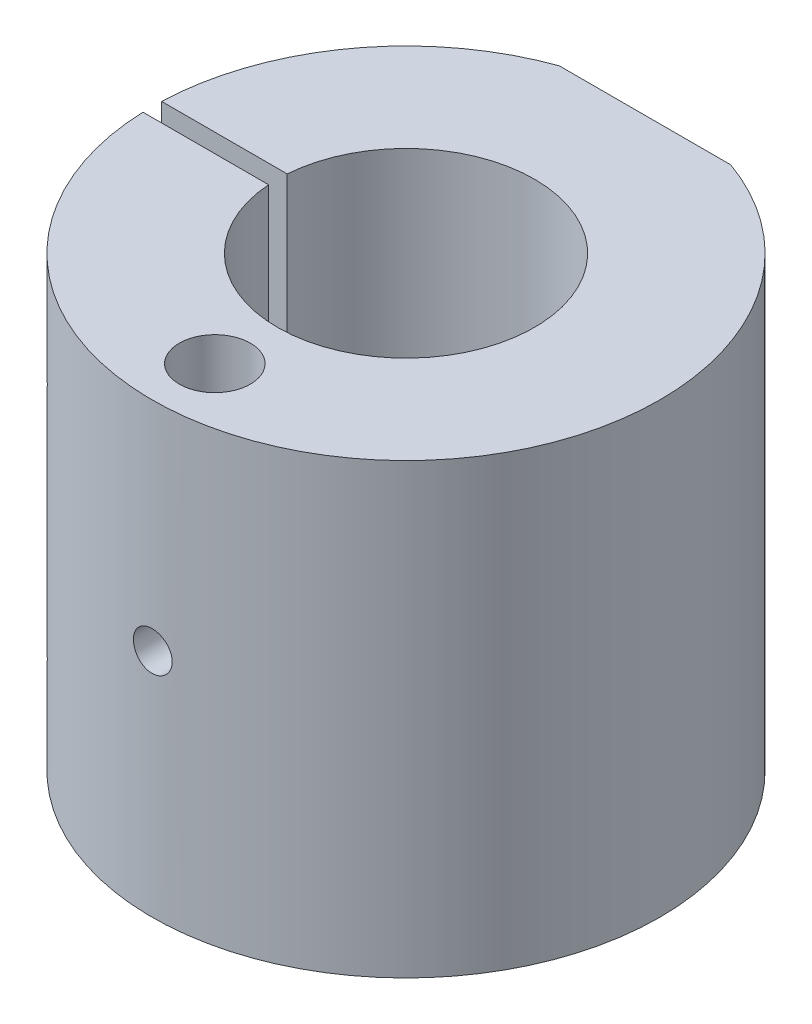
ISO-10303-21;
HEADER;
FILE_DESCRIPTION(('STEP AP214'),'2;1');
FILE_NAME('part.step','',(''),(''),'','','');
FILE_SCHEMA(('AUTOMOTIVE_DESIGN { 1 0 10303 214 1 1 1 1 }'));
ENDSEC;
DATA;
#1=APPLICATION_CONTEXT('core data for automotive mechanical design processes');
#2=APPLICATION_PROTOCOL_DEFINITION('international standard','automotive_design',2000,#1);
#3=PRODUCT_CONTEXT('',#1,'mechanical');
#4=PRODUCT('Part','Part','',(#3));
#5=PRODUCT_RELATED_PRODUCT_CATEGORY('part','',(#4));
#6=PRODUCT_DEFINITION_FORMATION('','',#4);
#7=PRODUCT_DEFINITION_CONTEXT('part definition',#1,'design');
#8=PRODUCT_DEFINITION('design','',#6,#7);
#9=PRODUCT_DEFINITION_SHAPE('','',#8);
#10=(LENGTH_UNIT() NAMED_UNIT(*) SI_UNIT(.MILLI.,.METRE.));
#11=(NAMED_UNIT(*) PLANE_ANGLE_UNIT() SI_UNIT($,.RADIAN.));
#12=(NAMED_UNIT(*) SI_UNIT($,.STERADIAN.) SOLID_ANGLE_UNIT());
#13=UNCERTAINTY_MEASURE_WITH_UNIT(LENGTH_MEASURE(1.E-05),#10,'distance_accuracy_value','');
#14=(GEOMETRIC_REPRESENTATION_CONTEXT(3) GLOBAL_UNCERTAINTY_ASSIGNED_CONTEXT((#13)) GLOBAL_UNIT_ASSIGNED_CONTEXT((#10,
#11,#12)) REPRESENTATION_CONTEXT('',''));
#15=CARTESIAN_POINT('',(0.,0.,0.));
#16=DIRECTION('',(0.,0.,1.));
#17=DIRECTION('',(1.,0.,0.));
#18=AXIS2_PLACEMENT_3D('',#15,#16,#17);
#19=CARTESIAN_POINT('',(0.,38.1,0.));
#20=DIRECTION('',(0.,-1.,0.));
#21=DIRECTION('',(0.,0.,-1.));
#22=AXIS2_PLACEMENT_3D('',#19,#20,#21);
#23=CYLINDRICAL_SURFACE('',#22,21.59);
#24=CARTESIAN_POINT('',(0.,38.1,0.));
#25=DIRECTION('',(0.,1.,0.));
#26=DIRECTION('',(0.,0.,1.));
#27=AXIS2_PLACEMENT_3D('',#24,#25,#26);
#28=CIRCLE('',#27,21.59);
#29=CARTESIAN_POINT('',(-7.29559456110329,38.1,-20.32));
#30=VERTEX_POINT('',#29);
#31=CARTESIAN_POINT('',(-21.5754040735626,38.1,-0.793749999999997));
#32=VERTEX_POINT('',#31);
#33=EDGE_CURVE('E41',#30,#32,#28,.T.);
#34=ORIENTED_EDGE('',*,*,#33,.F.);
#35=DIRECTION('',(0.,1.,0.));
#36=VECTOR('',#35,1.);
#37=CARTESIAN_POINT('',(-7.29559456110329,-0.001000000000001,-20.32));
#38=LINE('',#37,#36);
#39=CARTESIAN_POINT('',(-7.29559456110329,0.,-20.32));
#40=VERTEX_POINT('',#39);
#41=EDGE_CURVE('E100',#40,#30,#38,.T.);
#42=ORIENTED_EDGE('',*,*,#41,.F.);
#43=CARTESIAN_POINT('',(0.,0.,0.));
#44=DIRECTION('',(0.,1.,0.));
#45=DIRECTION('',(0.,0.,1.));
#46=AXIS2_PLACEMENT_3D('',#43,#44,#45);
#47=CIRCLE('',#46,21.59);
#48=CARTESIAN_POINT('',(-21.5754040735626,0.,-0.793749999999997));
#49=VERTEX_POINT('',#48);
#50=EDGE_CURVE('E139',#40,#49,#47,.T.);
#51=ORIENTED_EDGE('',*,*,#50,.T.);
#52=DIRECTION('',(0.,-1.,0.));
#53=VECTOR('',#52,1.);
#54=CARTESIAN_POINT('',(-21.5754040735626,38.1,-0.793749999999997));
#55=LINE('',#54,#53);
#56=EDGE_CURVE('E123',#32,#49,#55,.T.);
#57=ORIENTED_EDGE('',*,*,#56,.F.);
#58=EDGE_LOOP('',(#34,#42,#51,#57));
#59=FACE_BOUND('',#58,.T.);
#60=ADVANCED_FACE('F32',(#59),#23,.T.);
#61=CARTESIAN_POINT('',(0.,38.1,0.));
#62=DIRECTION('',(0.,1.,0.));
#63=DIRECTION('',(0.,0.,1.));
#64=AXIS2_PLACEMENT_3D('',#61,#62,#63);
#65=PLANE('',#64);
#66=DIRECTION('',(1.,0.,0.));
#67=VECTOR('',#66,1.);
#68=CARTESIAN_POINT('',(7.29559456110329,38.1,-20.32));
#69=LINE('',#68,#67);
#70=CARTESIAN_POINT('',(7.29559456110329,38.1,-20.32));
#71=VERTEX_POINT('',#70);
#72=EDGE_CURVE('E48',#30,#71,#69,.T.);
#73=ORIENTED_EDGE('',*,*,#72,.F.);
#74=ORIENTED_EDGE('',*,*,#33,.T.);
#75=DIRECTION('',(-1.,0.,0.));
#76=VECTOR('',#75,1.);
#77=CARTESIAN_POINT('',(0.,38.1,-0.79375));
#78=LINE('',#77,#76);
#79=CARTESIAN_POINT('',(-10.8931191555725,38.1,-0.793749999999999));
#80=VERTEX_POINT('',#79);
#81=EDGE_CURVE('E129',#80,#32,#78,.T.);
#82=ORIENTED_EDGE('',*,*,#81,.F.);
#83=CARTESIAN_POINT('',(0.,38.1,0.));
#84=DIRECTION('',(0.,1.,0.));
#85=DIRECTION('',(0.,0.,1.));
#86=AXIS2_PLACEMENT_3D('',#83,#84,#85);
#87=CIRCLE('',#86,10.922);
#88=CARTESIAN_POINT('',(-10.8931191555725,38.1,0.793750000000001));
#89=VERTEX_POINT('',#88);
#90=EDGE_CURVE('E136',#89,#80,#87,.T.);
#91=ORIENTED_EDGE('',*,*,#90,.F.);
#92=DIRECTION('',(1.,0.,0.));
#93=VECTOR('',#92,1.);
#94=CARTESIAN_POINT('',(0.,38.1,0.79375));
#95=LINE('',#94,#93);
#96=CARTESIAN_POINT('',(-21.5754040735626,38.1,0.793750000000003));
#97=VERTEX_POINT('',#96);
#98=EDGE_CURVE('E132',#97,#89,#95,.T.);
#99=ORIENTED_EDGE('',*,*,#98,.F.);
#100=EDGE_CURVE('E11',#97,#71,#28,.T.);
#101=ORIENTED_EDGE('',*,*,#100,.T.);
#102=EDGE_LOOP('',(#73,#74,#82,#91,#99,#101));
#103=FACE_BOUND('',#102,.T.);
#104=CARTESIAN_POINT('',(0.,38.1,16.256));
#105=DIRECTION('',(0.,1.,0.));
#106=DIRECTION('',(0.,0.,1.));
#107=AXIS2_PLACEMENT_3D('',#104,#105,#106);
#108=CIRCLE('',#107,3.0226);
#109=CARTESIAN_POINT('',(0.,38.1,19.2786));
#110=VERTEX_POINT('',#109);
#111=EDGE_CURVE('E112',#110,#110,#108,.T.);
#112=ORIENTED_EDGE('',*,*,#111,.F.);
#113=EDGE_LOOP('',(#112));
#114=FACE_BOUND('',#113,.T.);
#115=ADVANCED_FACE('F154',(#103,#114),#65,.T.);
#116=CARTESIAN_POINT('',(0.,0.,0.));
#117=DIRECTION('',(0.,1.,0.));
#118=DIRECTION('',(0.,0.,1.));
#119=AXIS2_PLACEMENT_3D('',#116,#117,#118);
#120=PLANE('',#119);
#121=CARTESIAN_POINT('',(0.,0.,16.256));
#122=DIRECTION('',(0.,1.,0.));
#123=DIRECTION('',(0.,0.,1.));
#124=AXIS2_PLACEMENT_3D('',#121,#122,#123);
#125=CIRCLE('',#124,3.0226);
#126=CARTESIAN_POINT('',(0.,0.,19.2786));
#127=VERTEX_POINT('',#126);
#128=EDGE_CURVE('E115',#127,#127,#125,.F.);
#129=ORIENTED_EDGE('',*,*,#128,.F.);
#130=EDGE_LOOP('',(#129));
#131=FACE_BOUND('',#130,.T.);
#132=ORIENTED_EDGE('',*,*,#50,.F.);
#133=DIRECTION('',(-1.,0.,0.));
#134=VECTOR('',#133,1.);
#135=CARTESIAN_POINT('',(7.29559456110329,0.,-20.32));
#136=LINE('',#135,#134);
#137=CARTESIAN_POINT('',(7.29559456110329,0.,-20.32));
#138=VERTEX_POINT('',#137);
#139=EDGE_CURVE('E109',#138,#40,#136,.T.);
#140=ORIENTED_EDGE('',*,*,#139,.F.);
#141=CARTESIAN_POINT('',(-21.5754040735626,0.,0.793750000000003));
#142=VERTEX_POINT('',#141);
#143=EDGE_CURVE('E36',#142,#138,#47,.T.);
#144=ORIENTED_EDGE('',*,*,#143,.F.);
#145=DIRECTION('',(-1.,0.,0.));
#146=VECTOR('',#145,1.);
#147=CARTESIAN_POINT('',(0.,0.,0.79375));
#148=LINE('',#147,#146);
#149=CARTESIAN_POINT('',(-10.8931191555725,0.,0.793750000000001));
#150=VERTEX_POINT('',#149);
#151=EDGE_CURVE('E127',#150,#142,#148,.T.);
#152=ORIENTED_EDGE('',*,*,#151,.F.);
#153=CARTESIAN_POINT('',(0.,0.,0.));
#154=DIRECTION('',(0.,1.,0.));
#155=DIRECTION('',(0.,0.,1.));
#156=AXIS2_PLACEMENT_3D('',#153,#154,#155);
#157=CIRCLE('',#156,10.922);
#158=CARTESIAN_POINT('',(-10.8931191555725,0.,-0.793749999999999));
#159=VERTEX_POINT('',#158);
#160=EDGE_CURVE('E135',#150,#159,#157,.T.);
#161=ORIENTED_EDGE('',*,*,#160,.T.);
#162=DIRECTION('',(1.,0.,0.));
#163=VECTOR('',#162,1.);
#164=CARTESIAN_POINT('',(0.,0.,-0.79375));
#165=LINE('',#164,#163);
#166=EDGE_CURVE('E56',#49,#159,#165,.T.);
#167=ORIENTED_EDGE('',*,*,#166,.F.);
#168=EDGE_LOOP('',(#132,#140,#144,#152,#161,#167));
#169=FACE_BOUND('',#168,.T.);
#170=ADVANCED_FACE('F145',(#131,#169),#120,.F.);
#171=CARTESIAN_POINT('',(-17.8842616145675,29.1092355947267,12.0946800909204));
#172=CARTESIAN_POINT('',(-17.8842585584311,29.1645112923969,12.0946849197344));
#173=CARTESIAN_POINT('',(-17.8814572272963,29.2198141170862,12.0988300645471));
#174=CARTESIAN_POINT('',(-17.8705178537524,29.3287236810063,12.114981650848));
#175=CARTESIAN_POINT('',(-17.8623733870349,29.3823282969634,12.1269975557019));
#176=CARTESIAN_POINT('',(-17.8390428583441,29.4983717990455,12.1612978423738));
#177=CARTESIAN_POINT('',(-17.8226798560821,29.5600623082845,12.1852913730921));
#178=CARTESIAN_POINT('',(-17.7844092639658,29.6779206339718,12.2410797122205));
#179=CARTESIAN_POINT('',(-17.7624916573325,29.7340782159082,12.272888611114));
#180=CARTESIAN_POINT('',(-17.7021786253477,29.8678650941383,12.3598131360766));
#181=CARTESIAN_POINT('',(-17.6610722740068,29.941887306217,12.4185541520384));
#182=CARTESIAN_POINT('',(-17.5722168533333,30.0782690994564,12.5439725121161));
#183=CARTESIAN_POINT('',(-17.5244513932063,30.140598984916,12.6106693784964));
#184=CARTESIAN_POINT('',(-17.4330611129427,30.2446953739167,12.7366173584903));
#185=CARTESIAN_POINT('',(-17.390220675252,30.2881462643902,12.7950704346375));
#186=CARTESIAN_POINT('',(-17.3018580064292,30.3687262773738,12.9143067796996));
#187=CARTESIAN_POINT('',(-17.2563341085997,30.4058514140689,12.9750914884301));
#188=CARTESIAN_POINT('',(-17.1630301734843,30.4742394300064,13.0982620054874));
#189=CARTESIAN_POINT('',(-17.1152487084977,30.5054985356958,13.1606488152965));
#190=CARTESIAN_POINT('',(-17.0177614025057,30.5624433797972,13.2864686226405));
#191=CARTESIAN_POINT('',(-16.9680547882346,30.5881268507293,13.3499020345623));
#192=CARTESIAN_POINT('',(-16.8107302256385,30.6597102193637,13.548316600322));
#193=CARTESIAN_POINT('',(-16.7001759514523,30.696334382109,13.6844250475389));
#194=CARTESIAN_POINT('',(-16.4736455196231,30.7458853081251,13.9563052067048));
#195=CARTESIAN_POINT('',(-16.3576704918395,30.7588169872829,14.0920769826691));
#196=CARTESIAN_POINT('',(-16.1227397021436,30.7596328204156,14.3602577938445));
#197=CARTESIAN_POINT('',(-16.0037976672796,30.7476166288553,14.4926780776448));
#198=CARTESIAN_POINT('',(-15.7653949829693,30.6959029004973,14.7516512659179));
#199=CARTESIAN_POINT('',(-15.6459351458561,30.656239241519,14.8782111492432));
#200=CARTESIAN_POINT('',(-15.44712543031,30.5621778983121,15.084040837782));
#201=CARTESIAN_POINT('',(-15.3666530646227,30.5159617818699,15.1659624368816));
#202=CARTESIAN_POINT('',(-15.2103500011545,30.4066084309901,15.3227122435066));
#203=CARTESIAN_POINT('',(-15.1345126755737,30.343496086993,15.3975506677569));
#204=CARTESIAN_POINT('',(-15.0081440129358,30.2161118135675,15.5206183746334));
#205=CARTESIAN_POINT('',(-14.9558643058362,30.1556286737283,15.5709592075219));
#206=CARTESIAN_POINT('',(-14.8585029439286,30.0238259659124,15.6638916091562));
#207=CARTESIAN_POINT('',(-14.8134122016301,29.9525203048657,15.7064929709427));
#208=CARTESIAN_POINT('',(-14.7406620301069,29.8139313265651,15.7747584769749));
#209=CARTESIAN_POINT('',(-14.7113204368668,29.7483633283255,15.8020989405364));
#210=CARTESIAN_POINT('',(-14.6608659703766,29.6114659544436,15.8489210375911));
#211=CARTESIAN_POINT('',(-14.6397487678209,29.5401396339109,15.8684068059724));
#212=CARTESIAN_POINT('',(-14.6070932631717,29.3930135812178,15.8984726656273));
#213=CARTESIAN_POINT('',(-14.5956123924403,29.3171898720288,15.9089993670831));
#214=CARTESIAN_POINT('',(-14.5833823428621,29.1639641962526,15.9202115284396));
#215=CARTESIAN_POINT('',(-14.5826288389539,29.0865628783317,15.9209009545349));
#216=CARTESIAN_POINT('',(-14.5914323644677,28.9406586228388,15.9128320278873));
#217=CARTESIAN_POINT('',(-14.599969761122,28.8720373546274,15.905007998292));
#218=CARTESIAN_POINT('',(-14.6251935422651,28.7376511212979,15.8818167866163));
#219=CARTESIAN_POINT('',(-14.6418801298901,28.6718862274257,15.8664494165019));
#220=CARTESIAN_POINT('',(-14.6829037339814,28.5431381235274,15.8284942082047));
#221=CARTESIAN_POINT('',(-14.7074156746269,28.4802603582335,15.8057410545568));
#222=CARTESIAN_POINT('',(-14.762676512127,28.3600195190934,15.7541395933262));
#223=CARTESIAN_POINT('',(-14.7934286040355,28.3026592925792,15.7252881630152));
#224=CARTESIAN_POINT('',(-14.8748081860302,28.1696146279086,15.6484033976926));
#225=CARTESIAN_POINT('',(-14.9281716891288,28.097216542698,15.5975637779813));
#226=CARTESIAN_POINT('',(-15.0420090865757,27.9652664469093,15.4878132414272));
#227=CARTESIAN_POINT('',(-15.1024977071319,27.9057417891195,15.4288855651509));
#228=CARTESIAN_POINT('',(-15.2516104423623,27.7789162389359,15.2817243823099));
#229=CARTESIAN_POINT('',(-15.3422565097745,27.7171182456415,15.1908074738995));
#230=CARTESIAN_POINT('',(-15.5273981404125,27.6145520590779,15.0015230460747));
#231=CARTESIAN_POINT('',(-15.6218992187096,27.5738152222445,14.903144666074));
#232=CARTESIAN_POINT('',(-15.8473927615106,27.4993517899627,14.6637054599595));
#233=CARTESIAN_POINT('',(-15.9788214439848,27.473937595291,14.5204359628176));
#234=CARTESIAN_POINT('',(-16.173602389331,27.4590640519481,14.3021803774759));
#235=CARTESIAN_POINT('',(-16.2382193297395,27.4579948276925,14.2287709400857));
#236=CARTESIAN_POINT('',(-16.3663180723804,27.463280561377,14.0812368456421));
#237=CARTESIAN_POINT('',(-16.4298003088919,27.4696326144428,14.0071124796897));
#238=CARTESIAN_POINT('',(-16.5566742161214,27.4897392317191,13.8569307243798));
#239=CARTESIAN_POINT('',(-16.6200323855149,27.5036555000825,13.7808670488909));
#240=CARTESIAN_POINT('',(-16.7448493511203,27.5388841052749,13.6289316863076));
#241=CARTESIAN_POINT('',(-16.8063087582584,27.5601940356278,13.5530599448266));
#242=CARTESIAN_POINT('',(-16.9269306239158,27.6102461409653,13.4021058087891));
#243=CARTESIAN_POINT('',(-16.9860959690377,27.6389786024766,13.3270225150763));
#244=CARTESIAN_POINT('',(-17.1017915387924,27.7041388111514,13.178228384632));
#245=CARTESIAN_POINT('',(-17.1583230595029,27.7405627235517,13.1045168838132));
#246=CARTESIAN_POINT('',(-17.2792735064005,27.8297127355676,12.9447569599658));
#247=CARTESIAN_POINT('',(-17.3430128361252,27.884241820427,12.8591847416955));
#248=CARTESIAN_POINT('',(-17.4646877403234,28.0065160425828,12.6934350982814));
#249=CARTESIAN_POINT('',(-17.5226292148152,28.0742475335283,12.6132522166944));
#250=CARTESIAN_POINT('',(-17.6154360323137,28.2040661962542,12.483150122214));
#251=CARTESIAN_POINT('',(-17.6522441974051,28.2625076184724,12.431005675959));
#252=CARTESIAN_POINT('',(-17.7201138987545,28.388244490511,12.3340641361412));
#253=CARTESIAN_POINT('',(-17.7511853404747,28.4555243287413,12.2892543933953));
#254=CARTESIAN_POINT('',(-17.7974218277339,28.5782160002861,12.2221533550142));
#255=CARTESIAN_POINT('',(-17.8145820634211,28.6313542701135,12.1971076601833));
#256=CARTESIAN_POINT('',(-17.8438317185316,28.7417777321301,12.1542768301767));
#257=CARTESIAN_POINT('',(-17.855931801176,28.7990539025784,12.1364764291857));
#258=CARTESIAN_POINT('',(-17.8713010471485,28.8987125838817,12.113827840313));
#259=CARTESIAN_POINT('',(-17.8761358244356,28.9403395398661,12.1066882968306));
#260=CARTESIAN_POINT('',(-17.8826172206868,29.0243842200103,12.097112657936));
#261=CARTESIAN_POINT('',(-17.884263960682,29.0668019140886,12.0946763839686));
#262=CARTESIAN_POINT('',(-17.8842616145675,29.1092355947267,12.0946800909204));
#263=B_SPLINE_CURVE_WITH_KNOTS('',3,(#171,#172,#173,#174,#175,#176,#177,#178,#179,#180,#181,
#182,#183,#184,#185,#186,#187,#188,#189,#190,#191,#192,#193,#194,#195,#196,#197,#198,#199,#200,
#201,#202,#203,#204,#205,#206,#207,#208,#209,#210,#211,#212,#213,#214,#215,#216,#217,#218,#219,
#220,#221,#222,#223,#224,#225,#226,#227,#228,#229,#230,#231,#232,#233,#234,#235,#236,#237,#238,
#239,#240,#241,#242,#243,#244,#245,#246,#247,#248,#249,#250,#251,#252,#253,#254,#255,#256,#257,
#258,#259,#260,#261,#262),.UNSPECIFIED.,.T.,.F.,(4,2,2,2,2,2,2,2,2,2,2,2,2,2,2,2,2,2,2,2,2,2,2,
2,2,2,2,2,2,2,2,2,2,2,2,2,2,2,2,2,2,2,2,2,2,4),(0.,0.165659078587435,0.331517702981557,
0.534935807254163,0.738723384473475,1.04616357672133,1.35437432358516,1.60753195243394,
1.86084850902818,2.11432746690892,2.36790931642835,2.90345810024024,3.43889575194419,
3.97219870933683,4.50484933018719,4.87506917664172,5.24474661167796,5.5271799054836,
5.80925329828255,6.03890387535631,6.26843340083052,6.49932137187992,6.73011625084476,
6.93791990459857,7.14572873857067,7.35855306871122,7.57148664440744,7.87970602018601,
8.18857398689369,8.6136715059996,9.03940011264916,9.62426561065011,9.9174726319828,
10.2105649231623,10.510184402259,10.8097064530741,11.108838503529,11.4078217649414,
11.7665166478851,12.1248427218824,12.3837748211045,12.6422555595924,12.8252366201451,
13.0078301190627,13.1350070090302,13.2621790707475),.UNSPECIFIED.);
#264=CARTESIAN_POINT('',(-17.8842616145675,29.1092355947267,12.0946800909204));
#265=VERTEX_POINT('',#264);
#266=EDGE_CURVE('E196',#265,#265,#263,.T.);
#267=ORIENTED_EDGE('',*,*,#266,.T.);
#268=EDGE_LOOP('',(#267));
#269=FACE_BOUND('',#268,.T.);
#270=CARTESIAN_POINT('',(-17.8842616145675,8.90395449077097,12.0946800909204));
#271=CARTESIAN_POINT('',(-17.8842585584311,8.95923018844116,12.0946849197344));
#272=CARTESIAN_POINT('',(-17.8814572272963,9.01453301313049,12.0988300645471));
#273=CARTESIAN_POINT('',(-17.8705178537524,9.12344257705059,12.114981650848));
#274=CARTESIAN_POINT('',(-17.8623733870349,9.17704719300767,12.1269975557019));
#275=CARTESIAN_POINT('',(-17.8390428583441,9.29309069508979,12.1612978423738));
#276=CARTESIAN_POINT('',(-17.8226798560821,9.35478120432878,12.1852913730921));
#277=CARTESIAN_POINT('',(-17.7844092639658,9.472639530016,12.2410797122205));
#278=CARTESIAN_POINT('',(-17.7624916573325,9.52879711195247,12.272888611114));
#279=CARTESIAN_POINT('',(-17.7021786253477,9.66258399018259,12.3598131360766));
#280=CARTESIAN_POINT('',(-17.6610722740068,9.73660620226129,12.4185541520384));
#281=CARTESIAN_POINT('',(-17.5722168533332,9.87298799550064,12.5439725121161));
#282=CARTESIAN_POINT('',(-17.5244513932063,9.93531788096027,12.6106693784964));
#283=CARTESIAN_POINT('',(-17.4330611129427,10.039414269961,12.7366173584903));
#284=CARTESIAN_POINT('',(-17.390220675252,10.0828651604344,12.7950704346375));
#285=CARTESIAN_POINT('',(-17.3018580064292,10.1634451734181,12.9143067796996));
#286=CARTESIAN_POINT('',(-17.2563341085997,10.2005703101132,12.9750914884301));
#287=CARTESIAN_POINT('',(-17.1630301734843,10.2689583260507,13.0982620054874));
#288=CARTESIAN_POINT('',(-17.1152487084977,10.3002174317401,13.1606488152965));
#289=CARTESIAN_POINT('',(-17.0177614025057,10.3571622758414,13.2864686226405));
#290=CARTESIAN_POINT('',(-16.9680547882346,10.3828457467735,13.3499020345623));
#291=CARTESIAN_POINT('',(-16.8107302256385,10.4544291154079,13.548316600322));
#292=CARTESIAN_POINT('',(-16.7001759514523,10.4910532781533,13.6844250475389));
#293=CARTESIAN_POINT('',(-16.4736455196231,10.5406042041693,13.9563052067048));
#294=CARTESIAN_POINT('',(-16.3576704918395,10.5535358833271,14.0920769826691));
#295=CARTESIAN_POINT('',(-16.1227397021436,10.5543517164599,14.3602577938445));
#296=CARTESIAN_POINT('',(-16.0037976672796,10.5423355248995,14.4926780776448));
#297=CARTESIAN_POINT('',(-15.7653949829692,10.4906217965416,14.7516512659179));
#298=CARTESIAN_POINT('',(-15.6459351458561,10.4509581375632,14.8782111492432));
#299=CARTESIAN_POINT('',(-15.44712543031,10.3568967943563,15.084040837782));
#300=CARTESIAN_POINT('',(-15.3666530646227,10.3106806779142,15.1659624368816));
#301=CARTESIAN_POINT('',(-15.2103500011545,10.2013273270343,15.3227122435066));
#302=CARTESIAN_POINT('',(-15.1345126755737,10.1382149830372,15.3975506677569));
#303=CARTESIAN_POINT('',(-15.0081440129358,10.0108307096118,15.5206183746334));
#304=CARTESIAN_POINT('',(-14.9558643058362,9.95034756977252,15.5709592075219));
#305=CARTESIAN_POINT('',(-14.8585029439286,9.81854486195667,15.6638916091562));
#306=CARTESIAN_POINT('',(-14.8134122016301,9.74723920090991,15.7064929709427));
#307=CARTESIAN_POINT('',(-14.7406620301069,9.60865022260932,15.7747584769749));
#308=CARTESIAN_POINT('',(-14.7113204368668,9.54308222436972,15.8020989405364));
#309=CARTESIAN_POINT('',(-14.6608659703766,9.40618485048783,15.8489210375911));
#310=CARTESIAN_POINT('',(-14.6397487678209,9.33485852995519,15.8684068059724));
#311=CARTESIAN_POINT('',(-14.6070932631717,9.18773247726206,15.8984726656274));
#312=CARTESIAN_POINT('',(-14.5956123924403,9.11190876807305,15.9089993670831));
#313=CARTESIAN_POINT('',(-14.5833823428621,8.95868309229688,15.9202115284396));
#314=CARTESIAN_POINT('',(-14.5826288389539,8.88128177437597,15.9209009545349));
#315=CARTESIAN_POINT('',(-14.5914323644677,8.73537751888308,15.9128320278873));
#316=CARTESIAN_POINT('',(-14.599969761122,8.66675625067163,15.905007998292));
#317=CARTESIAN_POINT('',(-14.6251935422651,8.53237001734219,15.8818167866163));
#318=CARTESIAN_POINT('',(-14.6418801298901,8.46660512347,15.8664494165019));
#319=CARTESIAN_POINT('',(-14.6829037339813,8.33785701957164,15.8284942082047));
#320=CARTESIAN_POINT('',(-14.7074156746269,8.27497925427777,15.8057410545568));
#321=CARTESIAN_POINT('',(-14.762676512127,8.15473841513762,15.7541395933262));
#322=CARTESIAN_POINT('',(-14.7934286040355,8.09737818862341,15.7252881630152));
#323=CARTESIAN_POINT('',(-14.8748081860302,7.96433352395281,15.6484033976926));
#324=CARTESIAN_POINT('',(-14.9281716891288,7.8919354387422,15.5975637779813));
#325=CARTESIAN_POINT('',(-15.0420090865757,7.75998534295359,15.4878132414272));
#326=CARTESIAN_POINT('',(-15.1024977071319,7.70046068516377,15.4288855651509));
#327=CARTESIAN_POINT('',(-15.2516104423623,7.57363513498014,15.2817243823099));
#328=CARTESIAN_POINT('',(-15.3422565097745,7.51183714168572,15.1908074738995));
#329=CARTESIAN_POINT('',(-15.5273981404125,7.40927095512215,15.0015230460747));
#330=CARTESIAN_POINT('',(-15.6218992187096,7.36853411828873,14.903144666074));
#331=CARTESIAN_POINT('',(-15.8473927615106,7.29407068600697,14.6637054599595));
#332=CARTESIAN_POINT('',(-15.9788214439848,7.26865649133528,14.5204359628176));
#333=CARTESIAN_POINT('',(-16.173602389331,7.25378294799231,14.3021803774759));
#334=CARTESIAN_POINT('',(-16.2382193297395,7.25271372373671,14.2287709400857));
#335=CARTESIAN_POINT('',(-16.3663180723804,7.25799945742126,14.0812368456421));
#336=CARTESIAN_POINT('',(-16.4298003088919,7.26435151048706,14.0071124796897));
#337=CARTESIAN_POINT('',(-16.5566742161214,7.2844581277634,13.8569307243798));
#338=CARTESIAN_POINT('',(-16.6200323855149,7.2983743961268,13.7808670488909));
#339=CARTESIAN_POINT('',(-16.7448493511203,7.33360300131918,13.6289316863076));
#340=CARTESIAN_POINT('',(-16.8063087582584,7.35491293167203,13.5530599448266));
#341=CARTESIAN_POINT('',(-16.9269306239159,7.40496503700958,13.4021058087891));
#342=CARTESIAN_POINT('',(-16.9860959690377,7.43369749852087,13.3270225150763));
#343=CARTESIAN_POINT('',(-17.1017915387924,7.49885770719569,13.178228384632));
#344=CARTESIAN_POINT('',(-17.1583230595029,7.53528161959592,13.1045168838132));
#345=CARTESIAN_POINT('',(-17.2792735064005,7.62443163161182,12.9447569599658));
#346=CARTESIAN_POINT('',(-17.3430128361253,7.67896071647124,12.8591847416954));
#347=CARTESIAN_POINT('',(-17.4646877403234,7.80123493862706,12.6934350982814));
#348=CARTESIAN_POINT('',(-17.5226292148152,7.86896642957252,12.6132522166944));
#349=CARTESIAN_POINT('',(-17.6154360323137,7.99878509229849,12.483150122214));
#350=CARTESIAN_POINT('',(-17.6522441974051,8.05722651451665,12.431005675959));
#351=CARTESIAN_POINT('',(-17.7201138987545,8.18296338655531,12.3340641361412));
#352=CARTESIAN_POINT('',(-17.7511853404747,8.25024322478559,12.2892543933953));
#353=CARTESIAN_POINT('',(-17.7974218277339,8.37293489633033,12.2221533550142));
#354=CARTESIAN_POINT('',(-17.8145820634211,8.42607316615779,12.1971076601833));
#355=CARTESIAN_POINT('',(-17.8438317185316,8.5364966281744,12.1542768301767));
#356=CARTESIAN_POINT('',(-17.855931801176,8.59377279862261,12.1364764291857));
#357=CARTESIAN_POINT('',(-17.8713010471485,8.69343147992598,12.113827840313));
#358=CARTESIAN_POINT('',(-17.8761358244355,8.73505843591039,12.1066882968306));
#359=CARTESIAN_POINT('',(-17.8826172206868,8.81910311605453,12.097112657936));
#360=CARTESIAN_POINT('',(-17.884263960682,8.86152081013288,12.0946763839686));
#361=CARTESIAN_POINT('',(-17.8842616145675,8.90395449077097,12.0946800909204));
#362=B_SPLINE_CURVE_WITH_KNOTS('',3,(#270,#271,#272,#273,#274,#275,#276,#277,#278,#279,#280,
#281,#282,#283,#284,#285,#286,#287,#288,#289,#290,#291,#292,#293,#294,#295,#296,#297,#298,#299,
#300,#301,#302,#303,#304,#305,#306,#307,#308,#309,#310,#311,#312,#313,#314,#315,#316,#317,#318,
#319,#320,#321,#322,#323,#324,#325,#326,#327,#328,#329,#330,#331,#332,#333,#334,#335,#336,#337,
#338,#339,#340,#341,#342,#343,#344,#345,#346,#347,#348,#349,#350,#351,#352,#353,#354,#355,#356,
#357,#358,#359,#360,#361),.UNSPECIFIED.,.T.,.F.,(4,2,2,2,2,2,2,2,2,2,2,2,2,2,2,2,2,2,2,2,2,2,2,
2,2,2,2,2,2,2,2,2,2,2,2,2,2,2,2,2,2,2,2,2,2,4),(0.,0.165659078587435,0.331517702981557,
0.534935807254161,0.738723384473473,1.04616357672132,1.35437432358516,1.60753195243394,
1.86084850902818,2.11432746690892,2.36790931642835,2.90345810024023,3.43889575194419,
3.97219870933683,4.50484933018719,4.87506917664172,5.24474661167796,5.5271799054836,
5.80925329828255,6.03890387535631,6.26843340083052,6.49932137187993,6.73011625084477,
6.93791990459857,7.14572873857067,7.35855306871122,7.57148664440744,7.87970602018602,
8.1885739868937,8.61367150599961,9.03940011264917,9.62426561065012,9.9174726319828,
10.2105649231624,10.510184402259,10.8097064530741,11.108838503529,11.4078217649415,
11.7665166478851,12.1248427218824,12.3837748211045,12.6422555595924,12.8252366201451,
13.0078301190627,13.1350070090302,13.2621790707475),.UNSPECIFIED.);
#363=CARTESIAN_POINT('',(-17.8842616145675,8.90395449077097,12.0946800909204));
#364=VERTEX_POINT('',#363);
#365=EDGE_CURVE('E200',#364,#364,#362,.T.);
#366=ORIENTED_EDGE('',*,*,#365,.T.);
#367=EDGE_LOOP('',(#366));
#368=FACE_BOUND('',#367,.T.);
#369=CARTESIAN_POINT('',(1.650000002,19.6091136223652,21.5268576432651));
#370=CARTESIAN_POINT('',(1.6499959484835,19.7016495301772,21.5268584828674));
#371=CARTESIAN_POINT('',(1.64218937460009,19.7942490882568,21.5274607301006));
#372=CARTESIAN_POINT('',(1.61116132517893,19.9768879887008,21.5298047344593));
#373=CARTESIAN_POINT('',(1.58792221035956,20.0669242783163,21.5315477954936));
#374=CARTESIAN_POINT('',(1.52670343023581,20.2417648648265,21.5359748535376));
#375=CARTESIAN_POINT('',(1.48873191245062,20.3265720236171,21.5386583303861));
#376=CARTESIAN_POINT('',(1.39914023253986,20.4885880626269,21.5446632045137));
#377=CARTESIAN_POINT('',(1.34752306350981,20.5657986040309,21.5479844618555));
#378=CARTESIAN_POINT('',(1.23198322679185,20.7106189513089,21.5548988207331));
#379=CARTESIAN_POINT('',(1.16803699183762,20.7782099320483,21.5584924347691));
#380=CARTESIAN_POINT('',(1.02970376732948,20.901710953639,21.5655418797799));
#381=CARTESIAN_POINT('',(0.95531632944572,20.9576204926498,21.5689977048301));
#382=CARTESIAN_POINT('',(0.798101725549279,21.0562328291459,21.5753869252764));
#383=CARTESIAN_POINT('',(0.71526444327578,21.0989195434552,21.5783196826312));
#384=CARTESIAN_POINT('',(0.543572291582214,21.1697716170398,21.5833268345826));
#385=CARTESIAN_POINT('',(0.45471751262407,21.1979371945587,21.5854012420795));
#386=CARTESIAN_POINT('',(0.273698326291558,21.2388938508225,21.5884543931829));
#387=CARTESIAN_POINT('',(0.181540785477342,21.2517151153443,21.5894352877184));
#388=CARTESIAN_POINT('',(-0.00362313915916579,21.2617124780048,21.5901981673171));
#389=CARTESIAN_POINT('',(-0.0966295094281109,21.2588888255127,21.5899801714899));
#390=CARTESIAN_POINT('',(-0.280646388378604,21.2377012667063,21.5883716141222));
#391=CARTESIAN_POINT('',(-0.371660659187562,21.2193698231942,21.5869835020336));
#392=CARTESIAN_POINT('',(-0.549316628881259,21.1677374857332,21.5831937136783));
#393=CARTESIAN_POINT('',(-0.635958291804592,21.1344364686933,21.5807920290772));
#394=CARTESIAN_POINT('',(-0.802513244761005,21.0537738861582,21.5752411489479));
#395=CARTESIAN_POINT('',(-0.882419436413835,21.0063977192091,21.5720911778363));
#396=CARTESIAN_POINT('',(-1.03315771568843,20.8989402788686,21.5653979027609));
#397=CARTESIAN_POINT('',(-1.10398964895209,20.8388587893988,21.5618545921081));
#398=CARTESIAN_POINT('',(-1.234758438147,20.7075130957109,21.5547623608137));
#399=CARTESIAN_POINT('',(-1.29466697725433,20.636220694955,21.5512134489888));
#400=CARTESIAN_POINT('',(-1.40166978758353,20.4845753598278,21.544519147857));
#401=CARTESIAN_POINT('',(-1.44876405051445,20.4042224195943,21.5413737588111));
#402=CARTESIAN_POINT('',(-1.52880005742395,20.236717729962,21.5358419356222));
#403=CARTESIAN_POINT('',(-1.56174043250881,20.1495653239152,21.5334555748945));
#404=CARTESIAN_POINT('',(-1.61251315844399,19.9709446740227,21.5297133070332));
#405=CARTESIAN_POINT('',(-1.63034577586995,19.8794765063584,21.5283573817178));
#406=CARTESIAN_POINT('',(-1.65036114370316,19.6950682776992,21.5268323414499));
#407=CARTESIAN_POINT('',(-1.65258333643419,19.6021325213865,21.5266602354051));
#408=CARTESIAN_POINT('',(-1.6414179975198,19.4172097356977,21.5275144196344));
#409=CARTESIAN_POINT('',(-1.62803058801773,19.3252226989038,21.5285407005314));
#410=CARTESIAN_POINT('',(-1.58605890295722,19.1449211398873,21.5316732882128));
#411=CARTESIAN_POINT('',(-1.55749294643917,19.0566023287123,21.533778292973));
#412=CARTESIAN_POINT('',(-1.4859936471408,18.8860115807527,21.53883004882));
#413=CARTESIAN_POINT('',(-1.44306010998515,18.8037397257942,21.5417768112946));
#414=CARTESIAN_POINT('',(-1.34394421016576,18.6473975438314,21.5481872974393));
#415=CARTESIAN_POINT('',(-1.28773551121914,18.5733439557325,21.5516520436452));
#416=CARTESIAN_POINT('',(-1.16370298851163,18.4357093917132,21.5587045924142));
#417=CARTESIAN_POINT('',(-1.09587899630432,18.3721285676962,21.5622923967612));
#418=CARTESIAN_POINT('',(-0.950370965768755,18.2571102345341,21.5691956493678));
#419=CARTESIAN_POINT('',(-0.872666668706348,18.2056983146203,21.5725105143063));
#420=CARTESIAN_POINT('',(-0.709705041138964,18.1166525863612,21.5784859953334));
#421=CARTESIAN_POINT('',(-0.624447775740301,18.0790186592645,21.5811466170608));
#422=CARTESIAN_POINT('',(-0.448892908247519,18.0186413593507,21.5855111154851));
#423=CARTESIAN_POINT('',(-0.358600821081326,17.9958820282336,21.5872160172515));
#424=CARTESIAN_POINT('',(-0.175463361476962,17.965847792067,21.5894811173072));
#425=CARTESIAN_POINT('',(-0.082618028949752,17.9585726451161,21.5900413334793));
#426=CARTESIAN_POINT('',(0.102737789602601,17.9597159219234,21.5899539797217));
#427=CARTESIAN_POINT('',(0.195248526049686,17.9680944071879,21.589309483479));
#428=CARTESIAN_POINT('',(0.37754512952071,18.0002239996613,21.5868912227957));
#429=CARTESIAN_POINT('',(0.467330992393093,18.0239751302905,21.5851174566346));
#430=CARTESIAN_POINT('',(0.641632896744942,18.0861660282799,21.580639794827));
#431=CARTESIAN_POINT('',(0.726149130270092,18.1246052599845,21.5779359331003));
#432=CARTESIAN_POINT('',(0.887534646975881,18.2150763982644,21.5719009689204));
#433=CARTESIAN_POINT('',(0.964404078982845,18.2671080402252,21.5685698786783));
#434=CARTESIAN_POINT('',(1.10851796263578,18.383436535709,21.5616445224484));
#435=CARTESIAN_POINT('',(1.17573865319282,18.4477627885067,21.5580496386274));
#436=CARTESIAN_POINT('',(1.29845414911382,18.586804683435,21.5510070662366));
#437=CARTESIAN_POINT('',(1.35394610031021,18.6615228471007,21.5475594136579));
#438=CARTESIAN_POINT('',(1.45169144007434,18.819350647511,21.5411954769709));
#439=CARTESIAN_POINT('',(1.49392296681253,18.9024738461203,21.5382800736338));
#440=CARTESIAN_POINT('',(1.56377665872452,19.0745954475548,21.5333216268362));
#441=CARTESIAN_POINT('',(1.59141573469855,19.1635869146082,21.5312775741225));
#442=CARTESIAN_POINT('',(1.6242079917856,19.31244446135,21.5288226064819));
#443=CARTESIAN_POINT('',(1.63386726660839,19.371351315649,21.5280890980355));
#444=CARTESIAN_POINT('',(1.64676457084589,19.4898678430645,21.5271063464113));
#445=CARTESIAN_POINT('',(1.65000261434749,19.549477514639,21.5268571021712));
#446=CARTESIAN_POINT('',(1.650000002,19.6091136223652,21.5268576432651));
#447=B_SPLINE_CURVE_WITH_KNOTS('',3,(#369,#370,#371,#372,#373,#374,#375,#376,#377,#378,#379,
#380,#381,#382,#383,#384,#385,#386,#387,#388,#389,#390,#391,#392,#393,#394,#395,#396,#397,#398,
#399,#400,#401,#402,#403,#404,#405,#406,#407,#408,#409,#410,#411,#412,#413,#414,#415,#416,#417,
#418,#419,#420,#421,#422,#423,#424,#425,#426,#427,#428,#429,#430,#431,#432,#433,#434,#435,#436,
#437,#438,#439,#440,#441,#442,#443,#444,#445,#446),.UNSPECIFIED.,.T.,.F.,(4,2,2,2,2,2,2,2,2,2,2,
2,2,2,2,2,2,2,2,2,2,2,2,2,2,2,2,2,2,2,2,2,2,2,2,2,2,2,4),(0.,0.277389993375635,
0.555097588454107,0.832651820214255,1.11014522248179,1.38817441445953,1.66621554825482,
1.94459355281952,2.22296737341483,2.50079266404199,2.77861352633814,3.05585425505405,
3.33309726349459,3.61062889202537,3.88816524089434,4.16641112679862,4.44465719273002,
4.72293016318479,5.00119822342464,5.27876293960639,5.55632548389062,5.83355379535567,
6.11078585752327,6.38857260357314,6.66636337846186,6.94473321323242,7.22310064869854,
7.50116894359112,7.77923289433746,8.0565883646356,8.3339442574851,8.61129003649736,
8.88863041659459,9.16664247248032,9.44472210440305,9.72325781459817,10.0014700247495,
10.1802384208154,10.3590064246991),.UNSPECIFIED.);
#448=CARTESIAN_POINT('',(1.650000002,19.6091136223652,21.5268576432651));
#449=VERTEX_POINT('',#448);
#450=EDGE_CURVE('E103',#449,#449,#447,.T.);
#451=ORIENTED_EDGE('',*,*,#450,.F.);
#452=EDGE_LOOP('',(#451));
#453=FACE_BOUND('',#452,.T.);
#454=ORIENTED_EDGE('',*,*,#143,.T.);
#455=DIRECTION('',(0.,1.,0.));
#456=VECTOR('',#455,1.);
#457=CARTESIAN_POINT('',(7.29559456110329,-0.001000000000001,-20.32));
#458=LINE('',#457,#456);
#459=EDGE_CURVE('E107',#138,#71,#458,.T.);
#460=ORIENTED_EDGE('',*,*,#459,.T.);
#461=ORIENTED_EDGE('',*,*,#100,.F.);
#462=DIRECTION('',(0.,-1.,0.));
#463=VECTOR('',#462,1.);
#464=CARTESIAN_POINT('',(-21.5754040735626,38.1,0.793750000000003));
#465=LINE('',#464,#463);
#466=EDGE_CURVE('E125',#142,#97,#465,.F.);
#467=ORIENTED_EDGE('',*,*,#466,.F.);
#468=EDGE_LOOP('',(#454,#460,#461,#467));
#469=FACE_BOUND('',#468,.T.);
#470=ADVANCED_FACE('F34',(#269,#368,#453,#469),#23,.T.);
#471=CARTESIAN_POINT('',(0.,38.1,0.));
#472=DIRECTION('',(0.,-1.,0.));
#473=DIRECTION('',(0.,0.,-1.));
#474=AXIS2_PLACEMENT_3D('',#471,#472,#473);
#475=CYLINDRICAL_SURFACE('',#474,10.922);
#476=DIRECTION('',(0.,-1.,0.));
#477=VECTOR('',#476,1.);
#478=CARTESIAN_POINT('',(-10.8931191555725,38.1,0.793750000000001));
#479=LINE('',#478,#477);
#480=EDGE_CURVE('E120',#150,#89,#479,.F.);
#481=ORIENTED_EDGE('',*,*,#480,.T.);
#482=ORIENTED_EDGE('',*,*,#90,.T.);
#483=DIRECTION('',(0.,-1.,0.));
#484=VECTOR('',#483,1.);
#485=CARTESIAN_POINT('',(-10.8931191555725,38.1,-0.793749999999999));
#486=LINE('',#485,#484);
#487=EDGE_CURVE('E118',#80,#159,#486,.T.);
#488=ORIENTED_EDGE('',*,*,#487,.T.);
#489=ORIENTED_EDGE('',*,*,#160,.F.);
#490=EDGE_LOOP('',(#481,#482,#488,#489));
#491=FACE_BOUND('',#490,.T.);
#492=ADVANCED_FACE('F148',(#491),#475,.F.);
#493=CARTESIAN_POINT('',(0.,-0.001000000000001,-0.79375));
#494=DIRECTION('',(0.,0.,-1.));
#495=DIRECTION('',(-1.,0.,0.));
#496=AXIS2_PLACEMENT_3D('',#493,#494,#495);
#497=PLANE('',#496);
#498=ORIENTED_EDGE('',*,*,#56,.T.);
#499=ORIENTED_EDGE('',*,*,#166,.T.);
#500=ORIENTED_EDGE('',*,*,#487,.F.);
#501=ORIENTED_EDGE('',*,*,#81,.T.);
#502=EDGE_LOOP('',(#498,#499,#500,#501));
#503=FACE_BOUND('',#502,.T.);
#504=ADVANCED_FACE('F151',(#503),#497,.F.);
#505=CARTESIAN_POINT('',(0.,-0.001000000000001,0.79375));
#506=DIRECTION('',(0.,0.,1.));
#507=DIRECTION('',(1.,0.,0.));
#508=AXIS2_PLACEMENT_3D('',#505,#506,#507);
#509=PLANE('',#508);
#510=CARTESIAN_POINT('',(-16.2342616145675,29.1092355947267,0.793750000000001));
#511=DIRECTION('',(0.,0.,-1.));
#512=DIRECTION('',(-1.,0.,0.));
#513=AXIS2_PLACEMENT_3D('',#510,#511,#512);
#514=CIRCLE('',#513,1.64999999999999);
#515=CARTESIAN_POINT('',(-17.8842616145675,29.1092355947267,0.793750000000001));
#516=VERTEX_POINT('',#515);
#517=EDGE_CURVE('E236',#516,#516,#514,.T.);
#518=ORIENTED_EDGE('',*,*,#517,.F.);
#519=EDGE_LOOP('',(#518));
#520=FACE_BOUND('',#519,.T.);
#521=CARTESIAN_POINT('',(-16.2342616145675,8.90395449077097,0.793750000000001));
#522=DIRECTION('',(0.,0.,-1.));
#523=DIRECTION('',(-1.,0.,0.));
#524=AXIS2_PLACEMENT_3D('',#521,#522,#523);
#525=CIRCLE('',#524,1.64999999999999);
#526=CARTESIAN_POINT('',(-17.8842616145675,8.90395449077097,0.793750000000001));
#527=VERTEX_POINT('',#526);
#528=EDGE_CURVE('E229',#527,#527,#525,.T.);
#529=ORIENTED_EDGE('',*,*,#528,.F.);
#530=EDGE_LOOP('',(#529));
#531=FACE_BOUND('',#530,.T.);
#532=ORIENTED_EDGE('',*,*,#466,.T.);
#533=ORIENTED_EDGE('',*,*,#98,.T.);
#534=ORIENTED_EDGE('',*,*,#480,.F.);
#535=ORIENTED_EDGE('',*,*,#151,.T.);
#536=EDGE_LOOP('',(#532,#533,#534,#535));
#537=FACE_BOUND('',#536,.T.);
#538=ADVANCED_FACE('F166',(#520,#531,#537),#509,.F.);
#539=CARTESIAN_POINT('',(0.,-0.001000000000001,16.256));
#540=DIRECTION('',(0.,1.,0.));
#541=DIRECTION('',(0.,0.,1.));
#542=AXIS2_PLACEMENT_3D('',#539,#540,#541);
#543=CYLINDRICAL_SURFACE('',#542,3.0226);
#544=CARTESIAN_POINT('',(1.650000002,19.6091136223652,18.7885107607669));
#545=CARTESIAN_POINT('',(1.64999354917031,19.5244288805994,18.7885196717397));
#546=CARTESIAN_POINT('',(1.64343528455106,19.4396671362053,18.7928254472447));
#547=CARTESIAN_POINT('',(1.61758568775694,19.2728503747495,18.8093793816895));
#548=CARTESIAN_POINT('',(1.5982724814128,19.1908002622948,18.8216411842345));
#549=CARTESIAN_POINT('',(1.54806304537805,19.0321516490009,18.8522398622198));
#550=CARTESIAN_POINT('',(1.51723808193849,18.9555229874079,18.8705392807754));
#551=CARTESIAN_POINT('',(1.44509936202344,18.8085526497579,18.9110906783753));
#552=CARTESIAN_POINT('',(1.40378353249123,18.7382122200113,18.9333434383618));
#553=CARTESIAN_POINT('',(1.30703134206783,18.5981150152518,18.981984343686));
#554=CARTESIAN_POINT('',(1.25059933067848,18.5291119474161,19.0085636670761));
#555=CARTESIAN_POINT('',(1.12727420874782,18.4009462777908,19.0613280625337));
#556=CARTESIAN_POINT('',(1.0603749761324,18.3417894769457,19.0875128939823));
#557=CARTESIAN_POINT('',(0.911152058279879,18.2300937526832,19.1391667416633));
#558=CARTESIAN_POINT('',(0.828003883126798,18.1785316243659,19.1643897928588));
#559=CARTESIAN_POINT('',(0.652575678882523,18.0904780601598,19.2086960482215));
#560=CARTESIAN_POINT('',(0.560302569702197,18.0539753109784,19.227783859071));
#561=CARTESIAN_POINT('',(0.377270068812995,18.000231632652,19.2562730178095));
#562=CARTESIAN_POINT('',(0.287009410376516,17.9816543299077,19.2663414691672));
#563=CARTESIAN_POINT('',(0.104140098102818,17.9598364114876,19.2781907632512));
#564=CARTESIAN_POINT('',(0.0115332437822573,17.9565843792845,19.2799777752014));
#565=CARTESIAN_POINT('',(-0.163133539110226,17.965113626616,19.2753281299459));
#566=CARTESIAN_POINT('',(-0.245295689066075,17.9753782103857,19.2697210647257));
#567=CARTESIAN_POINT('',(-0.406516106816362,18.0078619540991,19.2522360418832));
#568=CARTESIAN_POINT('',(-0.485574136403112,18.0300820295813,19.2403576040073));
#569=CARTESIAN_POINT('',(-0.639514213750986,18.0858594180712,19.2112232021451));
#570=CARTESIAN_POINT('',(-0.714340236679181,18.1195397099446,19.1939090709278));
#571=CARTESIAN_POINT('',(-0.857427905099154,18.1970423222597,19.1553837908295));
#572=CARTESIAN_POINT('',(-0.925687413707666,18.2408679285042,19.1341713798573));
#573=CARTESIAN_POINT('',(-1.06150117639177,18.3427519842424,19.0870822742167));
#574=CARTESIAN_POINT('',(-1.12820134260727,18.4018306741166,19.0609493863128));
#575=CARTESIAN_POINT('',(-1.25124911621148,18.5298674193958,19.0082674152833));
#576=CARTESIAN_POINT('',(-1.30758616831902,18.5988354216881,18.9817179373793));
#577=CARTESIAN_POINT('',(-1.41311705880903,18.7518180805201,18.9286373976501));
#578=CARTESIAN_POINT('',(-1.46128585680888,18.8366155275034,18.9023026617272));
#579=CARTESIAN_POINT('',(-1.54234723721429,19.0147948603356,18.8558989402514));
#580=CARTESIAN_POINT('',(-1.57525742652855,19.1081667023227,18.8358227417841));
#581=CARTESIAN_POINT('',(-1.62201640626286,19.293050047042,18.8066632211772));
#582=CARTESIAN_POINT('',(-1.63719280102361,19.384100054637,18.796821446995));
#583=CARTESIAN_POINT('',(-1.65205429431329,19.5679437566691,18.7871896484341));
#584=CARTESIAN_POINT('',(-1.6517563948073,19.6607354254074,18.7873885920796));
#585=CARTESIAN_POINT('',(-1.63689348742429,19.8312555976522,18.7970106591369));
#586=CARTESIAN_POINT('',(-1.62436238060987,19.9092504720605,18.805118666946));
#587=CARTESIAN_POINT('',(-1.58861580560679,20.0618188565148,18.8275467405353));
#588=CARTESIAN_POINT('',(-1.56539578177566,20.1363908928209,18.841869454889));
#589=CARTESIAN_POINT('',(-1.50796141703047,20.283704483806,18.875792833091));
#590=CARTESIAN_POINT('',(-1.4733194571752,20.3562314566751,18.8955929751895));
#591=CARTESIAN_POINT('',(-1.39437952526066,20.4948774675699,18.9381309547362));
#592=CARTESIAN_POINT('',(-1.35007673499462,20.5609932842635,18.9608702557366));
#593=CARTESIAN_POINT('',(-1.24505409636001,20.6957254432662,19.0109656183406));
#594=CARTESIAN_POINT('',(-1.18285233407096,20.7631297664376,19.0384894512533));
#595=CARTESIAN_POINT('',(-1.04778725724911,20.8870199776836,19.0921126939149));
#596=CARTESIAN_POINT('',(-0.9749179749894,20.9434997128958,19.1182112950521));
#597=CARTESIAN_POINT('',(-0.816048629087133,21.0464522098762,19.16759992714));
#598=CARTESIAN_POINT('',(-0.729584609132944,21.0923105445385,19.1906936501542));
#599=CARTESIAN_POINT('',(-0.548553131556718,21.1683440193331,19.2298431416975));
#600=CARTESIAN_POINT('',(-0.453994118733778,21.1985352767935,19.2459061403304));
#601=CARTESIAN_POINT('',(-0.269757315417935,21.239363386543,19.2678205163044));
#602=CARTESIAN_POINT('',(-0.180553187436672,21.2516692085055,19.2745404213617));
#603=CARTESIAN_POINT('',(-0.00110597688451039,21.2615542405049,19.279929520972));
#604=CARTESIAN_POINT('',(0.0891365529945762,21.2591409530033,19.2786028169554));
#605=CARTESIAN_POINT('',(0.25972621111077,21.2406033015092,19.2685272709119));
#606=CARTESIAN_POINT('',(0.340249523644113,21.2256941133759,19.2604363879441));
#607=CARTESIAN_POINT('',(0.497460987922556,21.1844355618582,19.2384396037311));
#608=CARTESIAN_POINT('',(0.574148674141392,21.1580848135619,19.2245329985455));
#609=CARTESIAN_POINT('',(0.72460537161904,21.0938276846566,19.1915070063789));
#610=CARTESIAN_POINT('',(0.798177319894543,21.0555480050281,19.1722217136848));
#611=CARTESIAN_POINT('',(0.938102140779607,20.9689817299713,19.1302684799924));
#612=CARTESIAN_POINT('',(1.00445202466007,20.9206910154762,19.1075991477003));
#613=CARTESIAN_POINT('',(1.13606683448482,20.8091623287734,19.0579553860028));
#614=CARTESIAN_POINT('',(1.20034744796205,20.744848358073,19.0307846981772));
#615=CARTESIAN_POINT('',(1.31768477056844,20.6063378143371,18.9770279630113));
#616=CARTESIAN_POINT('',(1.37072811575091,20.532129643519,18.9504426451036));
#617=CARTESIAN_POINT('',(1.4672579512596,20.3701013910373,18.899186917975));
#618=CARTESIAN_POINT('',(1.50992773798962,20.2817172228268,18.874743992464));
#619=CARTESIAN_POINT('',(1.57917323476772,20.0973095756679,18.8335910623724));
#620=CARTESIAN_POINT('',(1.60580063393689,20.0013117718807,18.8168562634346));
#621=CARTESIAN_POINT('',(1.63233394992115,19.8548961515096,18.799952026471));
#622=CARTESIAN_POINT('',(1.63894289738052,19.806082757508,18.7956859133039));
#623=CARTESIAN_POINT('',(1.64777779839477,19.707892850477,18.7899626858761));
#624=CARTESIAN_POINT('',(1.65000376640091,19.6585163393048,18.7885055623538));
#625=CARTESIAN_POINT('',(1.650000002,19.6091136223652,18.7885107607669));
#626=B_SPLINE_CURVE_WITH_KNOTS('',3,(#544,#545,#546,#547,#548,#549,#550,#551,#552,#553,#554,
#555,#556,#557,#558,#559,#560,#561,#562,#563,#564,#565,#566,#567,#568,#569,#570,#571,#572,#573,
#574,#575,#576,#577,#578,#579,#580,#581,#582,#583,#584,#585,#586,#587,#588,#589,#590,#591,#592,
#593,#594,#595,#596,#597,#598,#599,#600,#601,#602,#603,#604,#605,#606,#607,#608,#609,#610,#611,
#612,#613,#614,#615,#616,#617,#618,#619,#620,#621,#622,#623,#624,#625),.UNSPECIFIED.,.T.,.F.,(4,
2,2,2,2,2,2,2,2,2,2,2,2,2,2,2,2,2,2,2,2,2,2,2,2,2,2,2,2,2,2,2,2,2,2,2,2,2,2,2,4),(0.,
0.253844709011387,0.508125885033042,0.760858287546002,1.01364067038362,1.29156182039557,
1.56964613294583,1.87114798573936,2.17242292231375,2.44893998285774,2.72525102001738,
2.97304881829983,3.22086559536702,3.47143024244409,3.72207615469043,3.99949404012674,
4.27719294177164,4.57867576017766,4.8798098264142,5.15656179732666,5.43300970088471,
5.67016415500641,5.90741977864954,6.15481934249444,6.40234257683723,6.68838517922993,
6.97458841821304,7.27460285729017,7.57430804498573,7.84369943297911,8.11295352125329,
8.35870541389447,8.60448706118621,8.85889971418363,9.11341725444488,9.39692378919559,
9.68076561517839,9.98256094806655,10.2833786120778,10.4314650251991,10.5795509500589),.UNSPECIFIED.);
#627=CARTESIAN_POINT('',(1.650000002,19.6091136223652,18.7885107607669));
#628=VERTEX_POINT('',#627);
#629=EDGE_CURVE('E204',#628,#628,#626,.T.);
#630=ORIENTED_EDGE('',*,*,#629,.F.);
#631=EDGE_LOOP('',(#630));
#632=FACE_BOUND('',#631,.T.);
#633=ORIENTED_EDGE('',*,*,#111,.T.);
#634=EDGE_LOOP('',(#633));
#635=FACE_BOUND('',#634,.T.);
#636=ORIENTED_EDGE('',*,*,#128,.T.);
#637=EDGE_LOOP('',(#636));
#638=FACE_BOUND('',#637,.T.);
#639=ADVANCED_FACE('F168',(#632,#635,#638),#543,.F.);
#640=CARTESIAN_POINT('',(7.29559456110329,-0.001000000000001,-20.32));
#641=DIRECTION('',(0.,0.,1.));
#642=DIRECTION('',(1.,0.,0.));
#643=AXIS2_PLACEMENT_3D('',#640,#641,#642);
#644=PLANE('',#643);
#645=CARTESIAN_POINT('',(0.,19.05,-20.32));
#646=DIRECTION('',(0.,0.,-1.));
#647=DIRECTION('',(-1.,0.,0.));
#648=AXIS2_PLACEMENT_3D('',#645,#646,#647);
#649=CIRCLE('',#648,1.24999999999999);
#650=CARTESIAN_POINT('',(-1.24999999999999,19.05,-20.32));
#651=VERTEX_POINT('',#650);
#652=EDGE_CURVE('E98',#651,#651,#649,.T.);
#653=ORIENTED_EDGE('',*,*,#652,.F.);
#654=EDGE_LOOP('',(#653));
#655=FACE_BOUND('',#654,.T.);
#656=ORIENTED_EDGE('',*,*,#139,.T.);
#657=ORIENTED_EDGE('',*,*,#41,.T.);
#658=ORIENTED_EDGE('',*,*,#72,.T.);
#659=ORIENTED_EDGE('',*,*,#459,.F.);
#660=EDGE_LOOP('',(#656,#657,#658,#659));
#661=FACE_BOUND('',#660,.T.);
#662=ADVANCED_FACE('F92',(#655,#661),#644,.F.);
#663=CARTESIAN_POINT('',(0.,19.05,-15.748));
#664=DIRECTION('',(0.,0.,-1.));
#665=DIRECTION('',(-1.,0.,0.));
#666=AXIS2_PLACEMENT_3D('',#663,#664,#665);
#667=CONICAL_SURFACE('',#666,1.25,1.02974425867665);
#668=CARTESIAN_POINT('',(0.,19.05,-14.9969242262156));
#669=VERTEX_POINT('',#668);
#670=VERTEX_LOOP('',#669);
#671=FACE_BOUND('',#670,.T.);
#672=CARTESIAN_POINT('',(0.,19.05,-15.748));
#673=DIRECTION('',(0.,0.,-1.));
#674=DIRECTION('',(-1.,0.,0.));
#675=AXIS2_PLACEMENT_3D('',#672,#673,#674);
#676=CIRCLE('',#675,1.25);
#677=CARTESIAN_POINT('',(-1.25,19.05,-15.748));
#678=VERTEX_POINT('',#677);
#679=EDGE_CURVE('E96',#678,#678,#676,.T.);
#680=ORIENTED_EDGE('',*,*,#679,.T.);
#681=EDGE_LOOP('',(#680));
#682=FACE_BOUND('',#681,.T.);
#683=ADVANCED_FACE('F88',(#671,#682),#667,.F.);
#684=CARTESIAN_POINT('',(0.,19.05,-20.32));
#685=DIRECTION('',(0.,0.,-1.));
#686=DIRECTION('',(-1.,0.,0.));
#687=AXIS2_PLACEMENT_3D('',#684,#685,#686);
#688=CYLINDRICAL_SURFACE('',#687,1.24999999999999);
#689=ORIENTED_EDGE('',*,*,#679,.F.);
#690=EDGE_LOOP('',(#689));
#691=FACE_BOUND('',#690,.T.);
#692=ORIENTED_EDGE('',*,*,#652,.T.);
#693=EDGE_LOOP('',(#692));
#694=FACE_BOUND('',#693,.T.);
#695=ADVANCED_FACE('F91',(#691,#694),#688,.F.);
#696=CARTESIAN_POINT('',(0.,19.6091136223652,-20.321));
#697=DIRECTION('',(0.,0.,1.));
#698=DIRECTION('',(1.,0.,0.));
#699=AXIS2_PLACEMENT_3D('',#696,#697,#698);
#700=CYLINDRICAL_SURFACE('',#699,1.650000002);
#701=ORIENTED_EDGE('',*,*,#629,.T.);
#702=EDGE_LOOP('',(#701));
#703=FACE_BOUND('',#702,.T.);
#704=ORIENTED_EDGE('',*,*,#450,.T.);
#705=EDGE_LOOP('',(#704));
#706=FACE_BOUND('',#705,.T.);
#707=ADVANCED_FACE('F215',(#703,#706),#700,.F.);
#708=CARTESIAN_POINT('',(-16.2342616145675,8.90395449077097,0.793750000000002));
#709=DIRECTION('',(0.,0.,-1.));
#710=DIRECTION('',(-1.,0.,0.));
#711=AXIS2_PLACEMENT_3D('',#708,#709,#710);
#712=CYLINDRICAL_SURFACE('',#711,1.64999999999999);
#713=ORIENTED_EDGE('',*,*,#365,.F.);
#714=EDGE_LOOP('',(#713));
#715=FACE_BOUND('',#714,.T.);
#716=ORIENTED_EDGE('',*,*,#528,.T.);
#717=EDGE_LOOP('',(#716));
#718=FACE_BOUND('',#717,.T.);
#719=ADVANCED_FACE('F223',(#715,#718),#712,.F.);
#720=CARTESIAN_POINT('',(-16.2342616145675,29.1092355947267,0.793750000000002));
#721=DIRECTION('',(0.,0.,-1.));
#722=DIRECTION('',(-1.,0.,0.));
#723=AXIS2_PLACEMENT_3D('',#720,#721,#722);
#724=CYLINDRICAL_SURFACE('',#723,1.64999999999999);
#725=ORIENTED_EDGE('',*,*,#266,.F.);
#726=EDGE_LOOP('',(#725));
#727=FACE_BOUND('',#726,.T.);
#728=ORIENTED_EDGE('',*,*,#517,.T.);
#729=EDGE_LOOP('',(#728));
#730=FACE_BOUND('',#729,.T.);
#731=ADVANCED_FACE('F238',(#727,#730),#724,.F.);
#732=CLOSED_SHELL('',(#60,#115,#170,#470,#492,#504,#538,#639,#662,#683,#695,#707,#719,#731));
#733=MANIFOLD_SOLID_BREP('B2',#732);
#734=ADVANCED_BREP_SHAPE_REPRESENTATION('',(#18,#733),#14);
#735=SHAPE_DEFINITION_REPRESENTATION(#9,#734);
ENDSEC;
END-ISO-10303-21;
